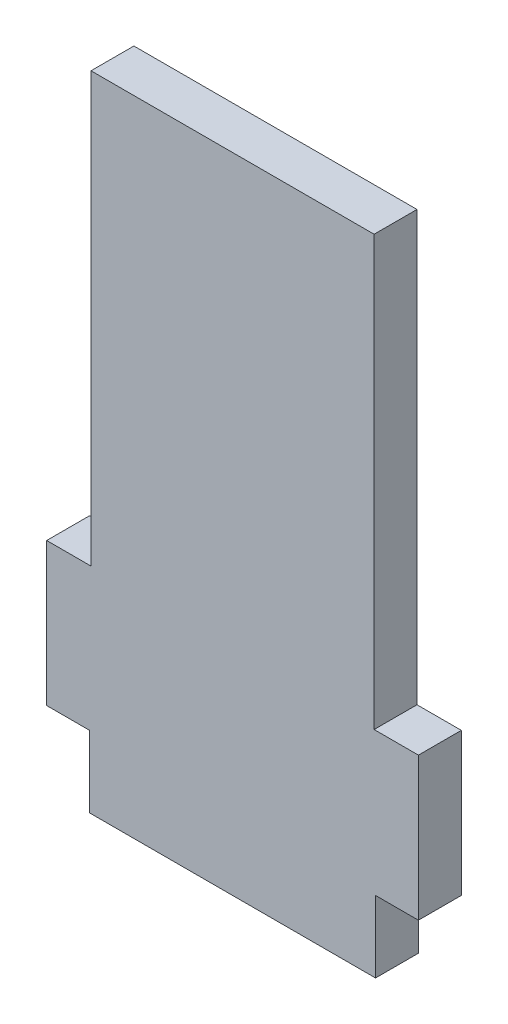
ISO-10303-21;
HEADER;
FILE_DESCRIPTION(('STEP AP214'),'2;1');
FILE_NAME('part.step','',(''),(''),'','','');
FILE_SCHEMA(('AUTOMOTIVE_DESIGN { 1 0 10303 214 1 1 1 1 }'));
ENDSEC;
DATA;
#1=APPLICATION_CONTEXT('core data for automotive mechanical design processes');
#2=APPLICATION_PROTOCOL_DEFINITION('international standard','automotive_design',2000,#1);
#3=PRODUCT_CONTEXT('',#1,'mechanical');
#4=PRODUCT('Part','Part','',(#3));
#5=PRODUCT_RELATED_PRODUCT_CATEGORY('part','',(#4));
#6=PRODUCT_DEFINITION_FORMATION('','',#4);
#7=PRODUCT_DEFINITION_CONTEXT('part definition',#1,'design');
#8=PRODUCT_DEFINITION('design','',#6,#7);
#9=PRODUCT_DEFINITION_SHAPE('','',#8);
#10=(LENGTH_UNIT() NAMED_UNIT(*) SI_UNIT(.MILLI.,.METRE.));
#11=(NAMED_UNIT(*) PLANE_ANGLE_UNIT() SI_UNIT($,.RADIAN.));
#12=(NAMED_UNIT(*) SI_UNIT($,.STERADIAN.) SOLID_ANGLE_UNIT());
#13=UNCERTAINTY_MEASURE_WITH_UNIT(LENGTH_MEASURE(1.E-05),#10,'distance_accuracy_value','');
#14=(GEOMETRIC_REPRESENTATION_CONTEXT(3) GLOBAL_UNCERTAINTY_ASSIGNED_CONTEXT((#13)) GLOBAL_UNIT_ASSIGNED_CONTEXT((#10,
#11,#12)) REPRESENTATION_CONTEXT('',''));
#15=CARTESIAN_POINT('',(0.,0.,0.));
#16=DIRECTION('',(0.,0.,1.));
#17=DIRECTION('',(1.,0.,0.));
#18=AXIS2_PLACEMENT_3D('',#15,#16,#17);
#19=CARTESIAN_POINT('',(0.,0.,0.));
#20=DIRECTION('',(0.,-1.,0.));
#21=DIRECTION('',(0.,0.,-1.));
#22=AXIS2_PLACEMENT_3D('',#19,#20,#21);
#23=PLANE('',#22);
#24=DIRECTION('',(0.,0.,1.));
#25=VECTOR('',#24,1.);
#26=CARTESIAN_POINT('',(10.,0.,-1.5));
#27=LINE('',#26,#25);
#28=CARTESIAN_POINT('',(9.99999999999999,0.,-1.5));
#29=VERTEX_POINT('',#28);
#30=CARTESIAN_POINT('',(9.99999999999999,0.,1.5));
#31=VERTEX_POINT('',#30);
#32=EDGE_CURVE('E61',#29,#31,#27,.T.);
#33=ORIENTED_EDGE('',*,*,#32,.F.);
#34=DIRECTION('',(-1.,0.,0.));
#35=VECTOR('',#34,1.);
#36=CARTESIAN_POINT('',(-13.,0.,-1.5));
#37=LINE('',#36,#35);
#38=CARTESIAN_POINT('',(13.,0.,-1.5));
#39=VERTEX_POINT('',#38);
#40=EDGE_CURVE('E224',#39,#29,#37,.T.);
#41=ORIENTED_EDGE('',*,*,#40,.F.);
#42=DIRECTION('',(0.,0.,-1.));
#43=VECTOR('',#42,1.);
#44=CARTESIAN_POINT('',(13.,0.,1.5));
#45=LINE('',#44,#43);
#46=CARTESIAN_POINT('',(13.,0.,1.5));
#47=VERTEX_POINT('',#46);
#48=EDGE_CURVE('E202',#47,#39,#45,.T.);
#49=ORIENTED_EDGE('',*,*,#48,.F.);
#50=DIRECTION('',(1.,0.,0.));
#51=VECTOR('',#50,1.);
#52=CARTESIAN_POINT('',(-13.,0.,1.5));
#53=LINE('',#52,#51);
#54=EDGE_CURVE('E66',#31,#47,#53,.T.);
#55=ORIENTED_EDGE('',*,*,#54,.F.);
#56=EDGE_LOOP('',(#33,#41,#49,#55));
#57=FACE_BOUND('',#56,.T.);
#58=ADVANCED_FACE('F45',(#57),#23,.T.);
#59=CARTESIAN_POINT('',(0.,10.,0.));
#60=DIRECTION('',(0.,-1.,0.));
#61=DIRECTION('',(0.,0.,-1.));
#62=AXIS2_PLACEMENT_3D('',#59,#60,#61);
#63=PLANE('',#62);
#64=DIRECTION('',(0.,0.,-1.));
#65=VECTOR('',#64,1.);
#66=CARTESIAN_POINT('',(9.9,10.,1.5));
#67=LINE('',#66,#65);
#68=CARTESIAN_POINT('',(9.89999999999999,10.,1.5));
#69=VERTEX_POINT('',#68);
#70=CARTESIAN_POINT('',(9.89999999999999,10.,-1.5));
#71=VERTEX_POINT('',#70);
#72=EDGE_CURVE('E159',#69,#71,#67,.T.);
#73=ORIENTED_EDGE('',*,*,#72,.F.);
#74=DIRECTION('',(1.,0.,0.));
#75=VECTOR('',#74,1.);
#76=CARTESIAN_POINT('',(-13.,10.,1.5));
#77=LINE('',#76,#75);
#78=CARTESIAN_POINT('',(13.,10.,1.5));
#79=VERTEX_POINT('',#78);
#80=EDGE_CURVE('E215',#69,#79,#77,.T.);
#81=ORIENTED_EDGE('',*,*,#80,.T.);
#82=DIRECTION('',(0.,0.,-1.));
#83=VECTOR('',#82,1.);
#84=CARTESIAN_POINT('',(13.,10.,1.5));
#85=LINE('',#84,#83);
#86=CARTESIAN_POINT('',(13.,10.,-1.5));
#87=VERTEX_POINT('',#86);
#88=EDGE_CURVE('E203',#79,#87,#85,.T.);
#89=ORIENTED_EDGE('',*,*,#88,.T.);
#90=DIRECTION('',(-1.,0.,0.));
#91=VECTOR('',#90,1.);
#92=CARTESIAN_POINT('',(-13.,10.,-1.5));
#93=LINE('',#92,#91);
#94=EDGE_CURVE('E209',#87,#71,#93,.T.);
#95=ORIENTED_EDGE('',*,*,#94,.T.);
#96=EDGE_LOOP('',(#73,#81,#89,#95));
#97=FACE_BOUND('',#96,.T.);
#98=ADVANCED_FACE('F281',(#97),#63,.F.);
#99=DIRECTION('',(0.,0.,1.));
#100=VECTOR('',#99,1.);
#101=CARTESIAN_POINT('',(-9.9,10.,1.5));
#102=LINE('',#101,#100);
#103=CARTESIAN_POINT('',(-9.9,10.,-1.5));
#104=VERTEX_POINT('',#103);
#105=CARTESIAN_POINT('',(-9.9,10.,1.5));
#106=VERTEX_POINT('',#105);
#107=EDGE_CURVE('E164',#104,#106,#102,.T.);
#108=ORIENTED_EDGE('',*,*,#107,.F.);
#109=CARTESIAN_POINT('',(-13.,10.,-1.5));
#110=VERTEX_POINT('',#109);
#111=EDGE_CURVE('E207',#104,#110,#93,.T.);
#112=ORIENTED_EDGE('',*,*,#111,.T.);
#113=DIRECTION('',(0.,0.,1.));
#114=VECTOR('',#113,1.);
#115=CARTESIAN_POINT('',(-13.,10.,1.5));
#116=LINE('',#115,#114);
#117=CARTESIAN_POINT('',(-13.,10.,1.5));
#118=VERTEX_POINT('',#117);
#119=EDGE_CURVE('E212',#110,#118,#116,.T.);
#120=ORIENTED_EDGE('',*,*,#119,.T.);
#121=EDGE_CURVE('E216',#118,#106,#77,.T.);
#122=ORIENTED_EDGE('',*,*,#121,.T.);
#123=EDGE_LOOP('',(#108,#112,#120,#122));
#124=FACE_BOUND('',#123,.T.);
#125=ADVANCED_FACE('F295',(#124),#63,.F.);
#126=CARTESIAN_POINT('',(13.,10.,1.5));
#127=DIRECTION('',(-1.,0.,0.));
#128=DIRECTION('',(0.,0.,1.));
#129=AXIS2_PLACEMENT_3D('',#126,#127,#128);
#130=PLANE('',#129);
#131=ORIENTED_EDGE('',*,*,#48,.T.);
#132=DIRECTION('',(0.,-1.,0.));
#133=VECTOR('',#132,1.);
#134=CARTESIAN_POINT('',(13.,10.,-1.5));
#135=LINE('',#134,#133);
#136=EDGE_CURVE('E11',#87,#39,#135,.T.);
#137=ORIENTED_EDGE('',*,*,#136,.F.);
#138=ORIENTED_EDGE('',*,*,#88,.F.);
#139=DIRECTION('',(0.,-1.,0.));
#140=VECTOR('',#139,1.);
#141=CARTESIAN_POINT('',(13.,10.,1.5));
#142=LINE('',#141,#140);
#143=EDGE_CURVE('E219',#79,#47,#142,.T.);
#144=ORIENTED_EDGE('',*,*,#143,.T.);
#145=EDGE_LOOP('',(#131,#137,#138,#144));
#146=FACE_BOUND('',#145,.T.);
#147=ADVANCED_FACE('F47',(#146),#130,.F.);
#148=CARTESIAN_POINT('',(-13.,10.,-1.5));
#149=DIRECTION('',(0.,0.,1.));
#150=DIRECTION('',(1.,0.,0.));
#151=AXIS2_PLACEMENT_3D('',#148,#149,#150);
#152=PLANE('',#151);
#153=ORIENTED_EDGE('',*,*,#40,.T.);
#154=DIRECTION('',(0.,1.,0.));
#155=VECTOR('',#154,1.);
#156=CARTESIAN_POINT('',(10.,-5.,-1.5));
#157=LINE('',#156,#155);
#158=CARTESIAN_POINT('',(10.,-5.,-1.5));
#159=VERTEX_POINT('',#158);
#160=EDGE_CURVE('E260',#159,#29,#157,.T.);
#161=ORIENTED_EDGE('',*,*,#160,.F.);
#162=DIRECTION('',(1.,0.,0.));
#163=VECTOR('',#162,1.);
#164=CARTESIAN_POINT('',(-10.,-5.,-1.5));
#165=LINE('',#164,#163);
#166=CARTESIAN_POINT('',(-10.,-5.,-1.5));
#167=VERTEX_POINT('',#166);
#168=EDGE_CURVE('E150',#167,#159,#165,.T.);
#169=ORIENTED_EDGE('',*,*,#168,.F.);
#170=DIRECTION('',(0.,1.,0.));
#171=VECTOR('',#170,1.);
#172=CARTESIAN_POINT('',(-10.,-5.,-1.5));
#173=LINE('',#172,#171);
#174=CARTESIAN_POINT('',(-10.,0.,-1.5));
#175=VERTEX_POINT('',#174);
#176=EDGE_CURVE('E166',#167,#175,#173,.T.);
#177=ORIENTED_EDGE('',*,*,#176,.T.);
#178=CARTESIAN_POINT('',(-13.,0.,-1.5));
#179=VERTEX_POINT('',#178);
#180=EDGE_CURVE('E223',#175,#179,#37,.T.);
#181=ORIENTED_EDGE('',*,*,#180,.T.);
#182=DIRECTION('',(0.,-1.,0.));
#183=VECTOR('',#182,1.);
#184=CARTESIAN_POINT('',(-13.,10.,-1.5));
#185=LINE('',#184,#183);
#186=EDGE_CURVE('E54',#110,#179,#185,.T.);
#187=ORIENTED_EDGE('',*,*,#186,.F.);
#188=ORIENTED_EDGE('',*,*,#111,.F.);
#189=DIRECTION('',(0.,-1.,0.));
#190=VECTOR('',#189,1.);
#191=CARTESIAN_POINT('',(-9.9,40.,-1.5));
#192=LINE('',#191,#190);
#193=CARTESIAN_POINT('',(-9.9,40.,-1.5));
#194=VERTEX_POINT('',#193);
#195=EDGE_CURVE('E194',#194,#104,#192,.T.);
#196=ORIENTED_EDGE('',*,*,#195,.F.);
#197=DIRECTION('',(-1.,0.,0.));
#198=VECTOR('',#197,1.);
#199=CARTESIAN_POINT('',(-9.9,40.,-1.5));
#200=LINE('',#199,#198);
#201=CARTESIAN_POINT('',(9.9,40.,-1.5));
#202=VERTEX_POINT('',#201);
#203=EDGE_CURVE('E174',#202,#194,#200,.T.);
#204=ORIENTED_EDGE('',*,*,#203,.F.);
#205=DIRECTION('',(0.,-1.,0.));
#206=VECTOR('',#205,1.);
#207=CARTESIAN_POINT('',(9.9,40.,-1.5));
#208=LINE('',#207,#206);
#209=EDGE_CURVE('E198',#202,#71,#208,.T.);
#210=ORIENTED_EDGE('',*,*,#209,.T.);
#211=ORIENTED_EDGE('',*,*,#94,.F.);
#212=ORIENTED_EDGE('',*,*,#136,.T.);
#213=EDGE_LOOP('',(#153,#161,#169,#177,#181,#187,#188,#196,#204,#210,#211,#212));
#214=FACE_BOUND('',#213,.T.);
#215=ADVANCED_FACE('F269',(#214),#152,.F.);
#216=CARTESIAN_POINT('',(-13.,10.,1.5));
#217=DIRECTION('',(1.,0.,0.));
#218=DIRECTION('',(0.,0.,-1.));
#219=AXIS2_PLACEMENT_3D('',#216,#217,#218);
#220=PLANE('',#219);
#221=DIRECTION('',(0.,0.,1.));
#222=VECTOR('',#221,1.);
#223=CARTESIAN_POINT('',(-13.,0.,1.5));
#224=LINE('',#223,#222);
#225=CARTESIAN_POINT('',(-13.,0.,1.5));
#226=VERTEX_POINT('',#225);
#227=EDGE_CURVE('E227',#179,#226,#224,.T.);
#228=ORIENTED_EDGE('',*,*,#227,.T.);
#229=DIRECTION('',(0.,-1.,0.));
#230=VECTOR('',#229,1.);
#231=CARTESIAN_POINT('',(-13.,10.,1.5));
#232=LINE('',#231,#230);
#233=EDGE_CURVE('E235',#118,#226,#232,.T.);
#234=ORIENTED_EDGE('',*,*,#233,.F.);
#235=ORIENTED_EDGE('',*,*,#119,.F.);
#236=ORIENTED_EDGE('',*,*,#186,.T.);
#237=EDGE_LOOP('',(#228,#234,#235,#236));
#238=FACE_BOUND('',#237,.T.);
#239=ADVANCED_FACE('F244',(#238),#220,.F.);
#240=CARTESIAN_POINT('',(-13.,10.,1.5));
#241=DIRECTION('',(0.,0.,-1.));
#242=DIRECTION('',(-1.,0.,0.));
#243=AXIS2_PLACEMENT_3D('',#240,#241,#242);
#244=PLANE('',#243);
#245=CARTESIAN_POINT('',(-10.,0.,1.5));
#246=VERTEX_POINT('',#245);
#247=EDGE_CURVE('E208',#226,#246,#53,.T.);
#248=ORIENTED_EDGE('',*,*,#247,.T.);
#249=DIRECTION('',(0.,1.,0.));
#250=VECTOR('',#249,1.);
#251=CARTESIAN_POINT('',(-10.,-5.,1.5));
#252=LINE('',#251,#250);
#253=CARTESIAN_POINT('',(-10.,-5.,1.5));
#254=VERTEX_POINT('',#253);
#255=EDGE_CURVE('E140',#254,#246,#252,.T.);
#256=ORIENTED_EDGE('',*,*,#255,.F.);
#257=DIRECTION('',(-1.,0.,0.));
#258=VECTOR('',#257,1.);
#259=CARTESIAN_POINT('',(-10.,-5.,1.5));
#260=LINE('',#259,#258);
#261=CARTESIAN_POINT('',(10.,-5.,1.5));
#262=VERTEX_POINT('',#261);
#263=EDGE_CURVE('E133',#262,#254,#260,.T.);
#264=ORIENTED_EDGE('',*,*,#263,.F.);
#265=DIRECTION('',(0.,1.,0.));
#266=VECTOR('',#265,1.);
#267=CARTESIAN_POINT('',(10.,-5.,1.5));
#268=LINE('',#267,#266);
#269=EDGE_CURVE('E138',#262,#31,#268,.T.);
#270=ORIENTED_EDGE('',*,*,#269,.T.);
#271=ORIENTED_EDGE('',*,*,#54,.T.);
#272=ORIENTED_EDGE('',*,*,#143,.F.);
#273=ORIENTED_EDGE('',*,*,#80,.F.);
#274=DIRECTION('',(0.,-1.,0.));
#275=VECTOR('',#274,1.);
#276=CARTESIAN_POINT('',(9.9,40.,1.5));
#277=LINE('',#276,#275);
#278=CARTESIAN_POINT('',(9.9,40.,1.5));
#279=VERTEX_POINT('',#278);
#280=EDGE_CURVE('E182',#279,#69,#277,.T.);
#281=ORIENTED_EDGE('',*,*,#280,.F.);
#282=DIRECTION('',(1.,0.,0.));
#283=VECTOR('',#282,1.);
#284=CARTESIAN_POINT('',(-9.9,40.,1.5));
#285=LINE('',#284,#283);
#286=CARTESIAN_POINT('',(-9.9,40.,1.5));
#287=VERTEX_POINT('',#286);
#288=EDGE_CURVE('E180',#287,#279,#285,.T.);
#289=ORIENTED_EDGE('',*,*,#288,.F.);
#290=DIRECTION('',(0.,-1.,0.));
#291=VECTOR('',#290,1.);
#292=CARTESIAN_POINT('',(-9.9,40.,1.5));
#293=LINE('',#292,#291);
#294=EDGE_CURVE('E190',#287,#106,#293,.T.);
#295=ORIENTED_EDGE('',*,*,#294,.T.);
#296=ORIENTED_EDGE('',*,*,#121,.F.);
#297=ORIENTED_EDGE('',*,*,#233,.T.);
#298=EDGE_LOOP('',(#248,#256,#264,#270,#271,#272,#273,#281,#289,#295,#296,#297));
#299=FACE_BOUND('',#298,.T.);
#300=ADVANCED_FACE('F136',(#299),#244,.F.);
#301=DIRECTION('',(0.,0.,-1.));
#302=VECTOR('',#301,1.);
#303=CARTESIAN_POINT('',(-10.,0.,-1.5));
#304=LINE('',#303,#302);
#305=EDGE_CURVE('E155',#246,#175,#304,.T.);
#306=ORIENTED_EDGE('',*,*,#305,.F.);
#307=ORIENTED_EDGE('',*,*,#247,.F.);
#308=ORIENTED_EDGE('',*,*,#227,.F.);
#309=ORIENTED_EDGE('',*,*,#180,.F.);
#310=EDGE_LOOP('',(#306,#307,#308,#309));
#311=FACE_BOUND('',#310,.T.);
#312=ADVANCED_FACE('F250',(#311),#23,.T.);
#313=CARTESIAN_POINT('',(9.9,40.,1.5));
#314=DIRECTION('',(-1.,0.,0.));
#315=DIRECTION('',(0.,0.,1.));
#316=AXIS2_PLACEMENT_3D('',#313,#314,#315);
#317=PLANE('',#316);
#318=ORIENTED_EDGE('',*,*,#72,.T.);
#319=ORIENTED_EDGE('',*,*,#209,.F.);
#320=DIRECTION('',(0.,0.,-1.));
#321=VECTOR('',#320,1.);
#322=CARTESIAN_POINT('',(9.9,40.,1.5));
#323=LINE('',#322,#321);
#324=EDGE_CURVE('E170',#279,#202,#323,.T.);
#325=ORIENTED_EDGE('',*,*,#324,.F.);
#326=ORIENTED_EDGE('',*,*,#280,.T.);
#327=EDGE_LOOP('',(#318,#319,#325,#326));
#328=FACE_BOUND('',#327,.T.);
#329=ADVANCED_FACE('F284',(#328),#317,.F.);
#330=CARTESIAN_POINT('',(-9.9,40.,1.5));
#331=DIRECTION('',(1.,0.,0.));
#332=DIRECTION('',(0.,0.,-1.));
#333=AXIS2_PLACEMENT_3D('',#330,#331,#332);
#334=PLANE('',#333);
#335=ORIENTED_EDGE('',*,*,#107,.T.);
#336=ORIENTED_EDGE('',*,*,#294,.F.);
#337=DIRECTION('',(0.,0.,1.));
#338=VECTOR('',#337,1.);
#339=CARTESIAN_POINT('',(-9.9,40.,1.5));
#340=LINE('',#339,#338);
#341=EDGE_CURVE('E177',#194,#287,#340,.T.);
#342=ORIENTED_EDGE('',*,*,#341,.F.);
#343=ORIENTED_EDGE('',*,*,#195,.T.);
#344=EDGE_LOOP('',(#335,#336,#342,#343));
#345=FACE_BOUND('',#344,.T.);
#346=ADVANCED_FACE('F293',(#345),#334,.F.);
#347=CARTESIAN_POINT('',(0.,40.,0.));
#348=DIRECTION('',(0.,-1.,0.));
#349=DIRECTION('',(0.,0.,-1.));
#350=AXIS2_PLACEMENT_3D('',#347,#348,#349);
#351=PLANE('',#350);
#352=ORIENTED_EDGE('',*,*,#324,.T.);
#353=ORIENTED_EDGE('',*,*,#203,.T.);
#354=ORIENTED_EDGE('',*,*,#341,.T.);
#355=ORIENTED_EDGE('',*,*,#288,.T.);
#356=EDGE_LOOP('',(#352,#353,#354,#355));
#357=FACE_BOUND('',#356,.T.);
#358=ADVANCED_FACE('F289',(#357),#351,.F.);
#359=CARTESIAN_POINT('',(10.,-5.,-1.5));
#360=DIRECTION('',(-1.,0.,0.));
#361=DIRECTION('',(0.,0.,1.));
#362=AXIS2_PLACEMENT_3D('',#359,#360,#361);
#363=PLANE('',#362);
#364=ORIENTED_EDGE('',*,*,#32,.T.);
#365=ORIENTED_EDGE('',*,*,#269,.F.);
#366=DIRECTION('',(0.,0.,1.));
#367=VECTOR('',#366,1.);
#368=CARTESIAN_POINT('',(10.,-5.,-1.5));
#369=LINE('',#368,#367);
#370=EDGE_CURVE('E145',#159,#262,#369,.T.);
#371=ORIENTED_EDGE('',*,*,#370,.F.);
#372=ORIENTED_EDGE('',*,*,#160,.T.);
#373=EDGE_LOOP('',(#364,#365,#371,#372));
#374=FACE_BOUND('',#373,.T.);
#375=ADVANCED_FACE('F157',(#374),#363,.F.);
#376=CARTESIAN_POINT('',(-10.,-5.,-1.5));
#377=DIRECTION('',(1.,0.,0.));
#378=DIRECTION('',(0.,0.,-1.));
#379=AXIS2_PLACEMENT_3D('',#376,#377,#378);
#380=PLANE('',#379);
#381=ORIENTED_EDGE('',*,*,#305,.T.);
#382=ORIENTED_EDGE('',*,*,#176,.F.);
#383=DIRECTION('',(0.,0.,-1.));
#384=VECTOR('',#383,1.);
#385=CARTESIAN_POINT('',(-10.,-5.,-1.5));
#386=LINE('',#385,#384);
#387=EDGE_CURVE('E144',#254,#167,#386,.T.);
#388=ORIENTED_EDGE('',*,*,#387,.F.);
#389=ORIENTED_EDGE('',*,*,#255,.T.);
#390=EDGE_LOOP('',(#381,#382,#388,#389));
#391=FACE_BOUND('',#390,.T.);
#392=ADVANCED_FACE('F254',(#391),#380,.F.);
#393=CARTESIAN_POINT('',(0.,-5.,0.));
#394=DIRECTION('',(0.,1.,0.));
#395=DIRECTION('',(0.,0.,1.));
#396=AXIS2_PLACEMENT_3D('',#393,#394,#395);
#397=PLANE('',#396);
#398=ORIENTED_EDGE('',*,*,#370,.T.);
#399=ORIENTED_EDGE('',*,*,#263,.T.);
#400=ORIENTED_EDGE('',*,*,#387,.T.);
#401=ORIENTED_EDGE('',*,*,#168,.T.);
#402=EDGE_LOOP('',(#398,#399,#400,#401));
#403=FACE_BOUND('',#402,.T.);
#404=ADVANCED_FACE('F148',(#403),#397,.F.);
#405=CLOSED_SHELL('',(#58,#98,#125,#147,#215,#239,#300,#312,#329,#346,#358,#375,#392,#404));
#406=MANIFOLD_SOLID_BREP('B2',#405);
#407=ADVANCED_BREP_SHAPE_REPRESENTATION('',(#18,#406),#14);
#408=SHAPE_DEFINITION_REPRESENTATION(#9,#407);
ENDSEC;
END-ISO-10303-21;
